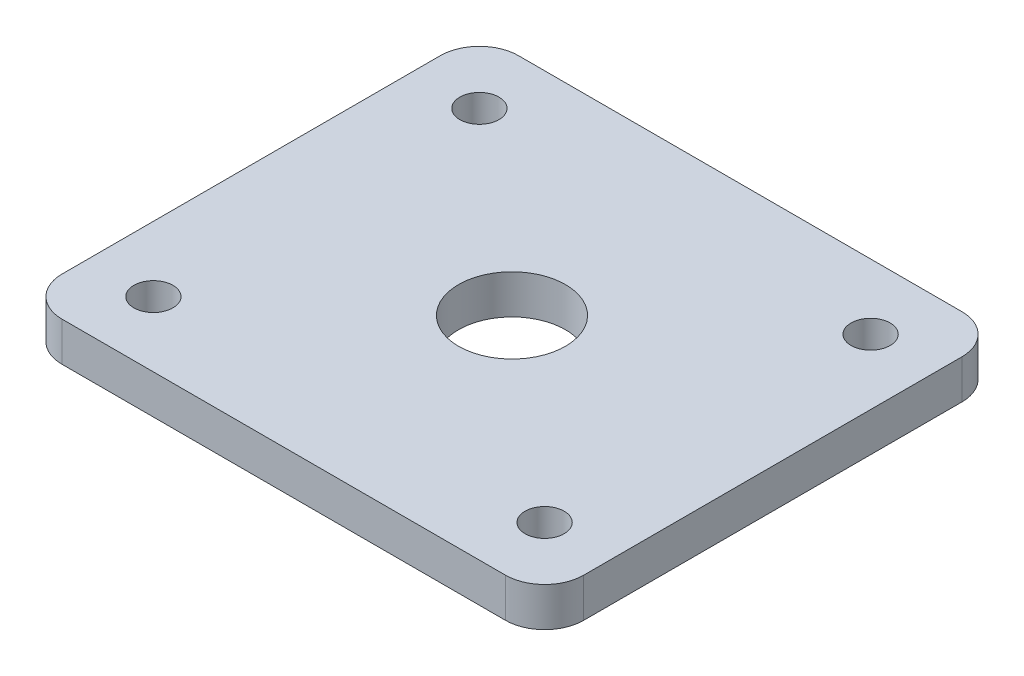
ISO-10303-21;
HEADER;
FILE_DESCRIPTION(('STEP AP214'),'2;1');
FILE_NAME('part.step','',(''),(''),'','','');
FILE_SCHEMA(('AUTOMOTIVE_DESIGN { 1 0 10303 214 1 1 1 1 }'));
ENDSEC;
DATA;
#1=APPLICATION_CONTEXT('core data for automotive mechanical design processes');
#2=APPLICATION_PROTOCOL_DEFINITION('international standard','automotive_design',2000,#1);
#3=PRODUCT_CONTEXT('',#1,'mechanical');
#4=PRODUCT('Part','Part','',(#3));
#5=PRODUCT_RELATED_PRODUCT_CATEGORY('part','',(#4));
#6=PRODUCT_DEFINITION_FORMATION('','',#4);
#7=PRODUCT_DEFINITION_CONTEXT('part definition',#1,'design');
#8=PRODUCT_DEFINITION('design','',#6,#7);
#9=PRODUCT_DEFINITION_SHAPE('','',#8);
#10=(LENGTH_UNIT() NAMED_UNIT(*) SI_UNIT(.MILLI.,.METRE.));
#11=(NAMED_UNIT(*) PLANE_ANGLE_UNIT() SI_UNIT($,.RADIAN.));
#12=(NAMED_UNIT(*) SI_UNIT($,.STERADIAN.) SOLID_ANGLE_UNIT());
#13=UNCERTAINTY_MEASURE_WITH_UNIT(LENGTH_MEASURE(1.E-05),#10,'distance_accuracy_value','');
#14=(GEOMETRIC_REPRESENTATION_CONTEXT(3) GLOBAL_UNCERTAINTY_ASSIGNED_CONTEXT((#13)) GLOBAL_UNIT_ASSIGNED_CONTEXT((#10,
#11,#12)) REPRESENTATION_CONTEXT('',''));
#15=CARTESIAN_POINT('',(0.,0.,0.));
#16=DIRECTION('',(0.,0.,1.));
#17=DIRECTION('',(1.,0.,0.));
#18=AXIS2_PLACEMENT_3D('',#15,#16,#17);
#19=CARTESIAN_POINT('',(0.,3.,-30.));
#20=DIRECTION('',(0.,0.,-1.));
#21=DIRECTION('',(-1.,0.,0.));
#22=AXIS2_PLACEMENT_3D('',#19,#20,#21);
#23=PLANE('',#22);
#24=DIRECTION('',(1.,0.,0.));
#25=VECTOR('',#24,1.);
#26=CARTESIAN_POINT('',(0.,3.,-30.));
#27=LINE('',#26,#25);
#28=CARTESIAN_POINT('',(-2.00000000000009,3.,-30.));
#29=VERTEX_POINT('',#28);
#30=CARTESIAN_POINT('',(31.9999999999999,3.,-30.));
#31=VERTEX_POINT('',#30);
#32=EDGE_CURVE('E157',#29,#31,#27,.T.);
#33=ORIENTED_EDGE('',*,*,#32,.T.);
#34=DIRECTION('',(0.,-1.,0.));
#35=VECTOR('',#34,1.);
#36=CARTESIAN_POINT('',(31.9999999999999,3.,-30.));
#37=LINE('',#36,#35);
#38=CARTESIAN_POINT('',(31.9999999999999,0.,-30.));
#39=VERTEX_POINT('',#38);
#40=EDGE_CURVE('E11',#31,#39,#37,.T.);
#41=ORIENTED_EDGE('',*,*,#40,.T.);
#42=DIRECTION('',(1.,0.,0.));
#43=VECTOR('',#42,1.);
#44=CARTESIAN_POINT('',(0.,0.,-30.));
#45=LINE('',#44,#43);
#46=CARTESIAN_POINT('',(-2.00000000000009,0.,-30.));
#47=VERTEX_POINT('',#46);
#48=EDGE_CURVE('E107',#47,#39,#45,.T.);
#49=ORIENTED_EDGE('',*,*,#48,.F.);
#50=DIRECTION('',(0.,-1.,0.));
#51=VECTOR('',#50,1.);
#52=CARTESIAN_POINT('',(-2.00000000000009,3.,-30.));
#53=LINE('',#52,#51);
#54=EDGE_CURVE('E42',#47,#29,#53,.F.);
#55=ORIENTED_EDGE('',*,*,#54,.T.);
#56=EDGE_LOOP('',(#33,#41,#49,#55));
#57=FACE_BOUND('',#56,.T.);
#58=ADVANCED_FACE('F34',(#57),#23,.T.);
#59=CARTESIAN_POINT('',(-5.00000000000009,3.,0.));
#60=DIRECTION('',(1.,0.,0.));
#61=DIRECTION('',(0.,0.,-1.));
#62=AXIS2_PLACEMENT_3D('',#59,#60,#61);
#63=PLANE('',#62);
#64=DIRECTION('',(0.,0.,1.));
#65=VECTOR('',#64,1.);
#66=CARTESIAN_POINT('',(-5.00000000000009,0.,0.));
#67=LINE('',#66,#65);
#68=CARTESIAN_POINT('',(-5.00000000000009,0.,-27.));
#69=VERTEX_POINT('',#68);
#70=CARTESIAN_POINT('',(-5.00000000000009,0.,2.));
#71=VERTEX_POINT('',#70);
#72=EDGE_CURVE('E168',#69,#71,#67,.T.);
#73=ORIENTED_EDGE('',*,*,#72,.T.);
#74=DIRECTION('',(0.,-1.,0.));
#75=VECTOR('',#74,1.);
#76=CARTESIAN_POINT('',(-5.00000000000009,3.,2.));
#77=LINE('',#76,#75);
#78=CARTESIAN_POINT('',(-5.00000000000009,3.,2.));
#79=VERTEX_POINT('',#78);
#80=EDGE_CURVE('E49',#71,#79,#77,.F.);
#81=ORIENTED_EDGE('',*,*,#80,.T.);
#82=DIRECTION('',(0.,0.,1.));
#83=VECTOR('',#82,1.);
#84=CARTESIAN_POINT('',(-5.00000000000009,3.,0.));
#85=LINE('',#84,#83);
#86=CARTESIAN_POINT('',(-5.00000000000009,3.,-27.));
#87=VERTEX_POINT('',#86);
#88=EDGE_CURVE('E162',#87,#79,#85,.T.);
#89=ORIENTED_EDGE('',*,*,#88,.F.);
#90=DIRECTION('',(0.,-1.,0.));
#91=VECTOR('',#90,1.);
#92=CARTESIAN_POINT('',(-5.00000000000009,0.,-27.));
#93=LINE('',#92,#91);
#94=EDGE_CURVE('E151',#87,#69,#93,.T.);
#95=ORIENTED_EDGE('',*,*,#94,.T.);
#96=EDGE_LOOP('',(#73,#81,#89,#95));
#97=FACE_BOUND('',#96,.T.);
#98=ADVANCED_FACE('F167',(#97),#63,.F.);
#99=CARTESIAN_POINT('',(0.,3.,5.));
#100=DIRECTION('',(0.,0.,-1.));
#101=DIRECTION('',(-1.,0.,0.));
#102=AXIS2_PLACEMENT_3D('',#99,#100,#101);
#103=PLANE('',#102);
#104=DIRECTION('',(1.,0.,0.));
#105=VECTOR('',#104,1.);
#106=CARTESIAN_POINT('',(0.,0.,5.));
#107=LINE('',#106,#105);
#108=CARTESIAN_POINT('',(-2.00000000000009,0.,5.));
#109=VERTEX_POINT('',#108);
#110=CARTESIAN_POINT('',(31.9999999999999,0.,5.));
#111=VERTEX_POINT('',#110);
#112=EDGE_CURVE('E123',#109,#111,#107,.T.);
#113=ORIENTED_EDGE('',*,*,#112,.T.);
#114=DIRECTION('',(0.,-1.,0.));
#115=VECTOR('',#114,1.);
#116=CARTESIAN_POINT('',(31.9999999999999,3.,5.));
#117=LINE('',#116,#115);
#118=CARTESIAN_POINT('',(31.9999999999999,3.,5.));
#119=VERTEX_POINT('',#118);
#120=EDGE_CURVE('E143',#111,#119,#117,.F.);
#121=ORIENTED_EDGE('',*,*,#120,.T.);
#122=DIRECTION('',(1.,0.,0.));
#123=VECTOR('',#122,1.);
#124=CARTESIAN_POINT('',(0.,3.,5.));
#125=LINE('',#124,#123);
#126=CARTESIAN_POINT('',(-2.00000000000009,3.,5.));
#127=VERTEX_POINT('',#126);
#128=EDGE_CURVE('E188',#127,#119,#125,.T.);
#129=ORIENTED_EDGE('',*,*,#128,.F.);
#130=DIRECTION('',(0.,-1.,0.));
#131=VECTOR('',#130,1.);
#132=CARTESIAN_POINT('',(-2.00000000000009,3.,5.));
#133=LINE('',#132,#131);
#134=EDGE_CURVE('E140',#127,#109,#133,.T.);
#135=ORIENTED_EDGE('',*,*,#134,.T.);
#136=EDGE_LOOP('',(#113,#121,#129,#135));
#137=FACE_BOUND('',#136,.T.);
#138=ADVANCED_FACE('F226',(#137),#103,.F.);
#139=CARTESIAN_POINT('',(34.9999999999999,3.,0.));
#140=DIRECTION('',(1.,0.,0.));
#141=DIRECTION('',(0.,0.,-1.));
#142=AXIS2_PLACEMENT_3D('',#139,#140,#141);
#143=PLANE('',#142);
#144=DIRECTION('',(0.,0.,1.));
#145=VECTOR('',#144,1.);
#146=CARTESIAN_POINT('',(34.9999999999999,3.,0.));
#147=LINE('',#146,#145);
#148=CARTESIAN_POINT('',(34.9999999999999,3.,-27.));
#149=VERTEX_POINT('',#148);
#150=CARTESIAN_POINT('',(34.9999999999999,3.,2.));
#151=VERTEX_POINT('',#150);
#152=EDGE_CURVE('E132',#149,#151,#147,.T.);
#153=ORIENTED_EDGE('',*,*,#152,.T.);
#154=DIRECTION('',(0.,-1.,0.));
#155=VECTOR('',#154,1.);
#156=CARTESIAN_POINT('',(34.9999999999999,0.,2.));
#157=LINE('',#156,#155);
#158=CARTESIAN_POINT('',(34.9999999999999,0.,2.));
#159=VERTEX_POINT('',#158);
#160=EDGE_CURVE('E121',#151,#159,#157,.T.);
#161=ORIENTED_EDGE('',*,*,#160,.T.);
#162=DIRECTION('',(0.,0.,1.));
#163=VECTOR('',#162,1.);
#164=CARTESIAN_POINT('',(34.9999999999999,0.,0.));
#165=LINE('',#164,#163);
#166=CARTESIAN_POINT('',(34.9999999999999,0.,-27.));
#167=VERTEX_POINT('',#166);
#168=EDGE_CURVE('E105',#167,#159,#165,.T.);
#169=ORIENTED_EDGE('',*,*,#168,.F.);
#170=DIRECTION('',(0.,-1.,0.));
#171=VECTOR('',#170,1.);
#172=CARTESIAN_POINT('',(34.9999999999999,3.,-27.));
#173=LINE('',#172,#171);
#174=EDGE_CURVE('E118',#167,#149,#173,.F.);
#175=ORIENTED_EDGE('',*,*,#174,.T.);
#176=EDGE_LOOP('',(#153,#161,#169,#175));
#177=FACE_BOUND('',#176,.T.);
#178=ADVANCED_FACE('F117',(#177),#143,.T.);
#179=CARTESIAN_POINT('',(0.,3.,0.));
#180=DIRECTION('',(0.,-1.,0.));
#181=DIRECTION('',(0.,0.,-1.));
#182=AXIS2_PLACEMENT_3D('',#179,#180,#181);
#183=CYLINDRICAL_SURFACE('',#182,1.5);
#184=CARTESIAN_POINT('',(0.,3.,0.));
#185=DIRECTION('',(0.,1.,0.));
#186=DIRECTION('',(0.,0.,1.));
#187=AXIS2_PLACEMENT_3D('',#184,#185,#186);
#188=CIRCLE('',#187,1.5);
#189=CARTESIAN_POINT('',(0.,3.,1.5));
#190=VERTEX_POINT('',#189);
#191=EDGE_CURVE('E163',#190,#190,#188,.T.);
#192=ORIENTED_EDGE('',*,*,#191,.T.);
#193=EDGE_LOOP('',(#192));
#194=FACE_BOUND('',#193,.T.);
#195=CARTESIAN_POINT('',(0.,0.,0.));
#196=DIRECTION('',(0.,1.,0.));
#197=DIRECTION('',(0.,0.,1.));
#198=AXIS2_PLACEMENT_3D('',#195,#196,#197);
#199=CIRCLE('',#198,1.5);
#200=CARTESIAN_POINT('',(0.,0.,1.5));
#201=VERTEX_POINT('',#200);
#202=EDGE_CURVE('E173',#201,#201,#199,.T.);
#203=ORIENTED_EDGE('',*,*,#202,.F.);
#204=EDGE_LOOP('',(#203));
#205=FACE_BOUND('',#204,.T.);
#206=ADVANCED_FACE('F230',(#194,#205),#183,.F.);
#207=CARTESIAN_POINT('',(30.,3.,0.));
#208=DIRECTION('',(0.,-1.,0.));
#209=DIRECTION('',(0.,0.,-1.));
#210=AXIS2_PLACEMENT_3D('',#207,#208,#209);
#211=CYLINDRICAL_SURFACE('',#210,1.5);
#212=CARTESIAN_POINT('',(30.,3.,0.));
#213=DIRECTION('',(0.,1.,0.));
#214=DIRECTION('',(0.,0.,1.));
#215=AXIS2_PLACEMENT_3D('',#212,#213,#214);
#216=CIRCLE('',#215,1.5);
#217=CARTESIAN_POINT('',(30.,3.,1.5));
#218=VERTEX_POINT('',#217);
#219=EDGE_CURVE('E193',#218,#218,#216,.T.);
#220=ORIENTED_EDGE('',*,*,#219,.T.);
#221=EDGE_LOOP('',(#220));
#222=FACE_BOUND('',#221,.T.);
#223=CARTESIAN_POINT('',(30.,0.,0.));
#224=DIRECTION('',(0.,1.,0.));
#225=DIRECTION('',(0.,0.,1.));
#226=AXIS2_PLACEMENT_3D('',#223,#224,#225);
#227=CIRCLE('',#226,1.5);
#228=CARTESIAN_POINT('',(30.,0.,1.5));
#229=VERTEX_POINT('',#228);
#230=EDGE_CURVE('E178',#229,#229,#227,.T.);
#231=ORIENTED_EDGE('',*,*,#230,.F.);
#232=EDGE_LOOP('',(#231));
#233=FACE_BOUND('',#232,.T.);
#234=ADVANCED_FACE('F233',(#222,#233),#211,.F.);
#235=CARTESIAN_POINT('',(29.9999999999999,3.,-25.));
#236=DIRECTION('',(0.,-1.,0.));
#237=DIRECTION('',(0.,0.,-1.));
#238=AXIS2_PLACEMENT_3D('',#235,#236,#237);
#239=CYLINDRICAL_SURFACE('',#238,1.5);
#240=CARTESIAN_POINT('',(29.9999999999999,3.,-25.));
#241=DIRECTION('',(0.,1.,0.));
#242=DIRECTION('',(0.,0.,1.));
#243=AXIS2_PLACEMENT_3D('',#240,#241,#242);
#244=CIRCLE('',#243,1.5);
#245=CARTESIAN_POINT('',(29.9999999999999,3.,-23.5));
#246=VERTEX_POINT('',#245);
#247=EDGE_CURVE('E196',#246,#246,#244,.T.);
#248=ORIENTED_EDGE('',*,*,#247,.T.);
#249=EDGE_LOOP('',(#248));
#250=FACE_BOUND('',#249,.T.);
#251=CARTESIAN_POINT('',(29.9999999999999,0.,-25.));
#252=DIRECTION('',(0.,1.,0.));
#253=DIRECTION('',(0.,0.,1.));
#254=AXIS2_PLACEMENT_3D('',#251,#252,#253);
#255=CIRCLE('',#254,1.5);
#256=CARTESIAN_POINT('',(29.9999999999999,0.,-23.5));
#257=VERTEX_POINT('',#256);
#258=EDGE_CURVE('E181',#257,#257,#255,.T.);
#259=ORIENTED_EDGE('',*,*,#258,.F.);
#260=EDGE_LOOP('',(#259));
#261=FACE_BOUND('',#260,.T.);
#262=ADVANCED_FACE('F217',(#250,#261),#239,.F.);
#263=CARTESIAN_POINT('',(0.,3.,-25.));
#264=DIRECTION('',(0.,-1.,0.));
#265=DIRECTION('',(0.,0.,-1.));
#266=AXIS2_PLACEMENT_3D('',#263,#264,#265);
#267=CYLINDRICAL_SURFACE('',#266,1.5);
#268=CARTESIAN_POINT('',(0.,3.,-25.));
#269=DIRECTION('',(0.,1.,0.));
#270=DIRECTION('',(0.,0.,1.));
#271=AXIS2_PLACEMENT_3D('',#268,#269,#270);
#272=CIRCLE('',#271,1.5);
#273=CARTESIAN_POINT('',(0.,3.,-23.5));
#274=VERTEX_POINT('',#273);
#275=EDGE_CURVE('E199',#274,#274,#272,.T.);
#276=ORIENTED_EDGE('',*,*,#275,.T.);
#277=EDGE_LOOP('',(#276));
#278=FACE_BOUND('',#277,.T.);
#279=CARTESIAN_POINT('',(0.,0.,-25.));
#280=DIRECTION('',(0.,1.,0.));
#281=DIRECTION('',(0.,0.,1.));
#282=AXIS2_PLACEMENT_3D('',#279,#280,#281);
#283=CIRCLE('',#282,1.5);
#284=CARTESIAN_POINT('',(0.,0.,-23.5));
#285=VERTEX_POINT('',#284);
#286=EDGE_CURVE('E184',#285,#285,#283,.T.);
#287=ORIENTED_EDGE('',*,*,#286,.F.);
#288=EDGE_LOOP('',(#287));
#289=FACE_BOUND('',#288,.T.);
#290=ADVANCED_FACE('F208',(#278,#289),#267,.F.);
#291=CARTESIAN_POINT('',(14.9999999999999,3.,-12.5));
#292=DIRECTION('',(0.,-1.,0.));
#293=DIRECTION('',(0.,0.,-1.));
#294=AXIS2_PLACEMENT_3D('',#291,#292,#293);
#295=CYLINDRICAL_SURFACE('',#294,4.1);
#296=CARTESIAN_POINT('',(14.9999999999999,3.,-12.5));
#297=DIRECTION('',(0.,1.,0.));
#298=DIRECTION('',(0.,0.,1.));
#299=AXIS2_PLACEMENT_3D('',#296,#297,#298);
#300=CIRCLE('',#299,4.1);
#301=CARTESIAN_POINT('',(14.9999999999999,3.,-8.4));
#302=VERTEX_POINT('',#301);
#303=EDGE_CURVE('E128',#302,#302,#300,.T.);
#304=ORIENTED_EDGE('',*,*,#303,.T.);
#305=EDGE_LOOP('',(#304));
#306=FACE_BOUND('',#305,.T.);
#307=CARTESIAN_POINT('',(14.9999999999999,0.,-12.5));
#308=DIRECTION('',(0.,1.,0.));
#309=DIRECTION('',(0.,0.,1.));
#310=AXIS2_PLACEMENT_3D('',#307,#308,#309);
#311=CIRCLE('',#310,4.1);
#312=CARTESIAN_POINT('',(14.9999999999999,0.,-8.4));
#313=VERTEX_POINT('',#312);
#314=EDGE_CURVE('E122',#313,#313,#311,.T.);
#315=ORIENTED_EDGE('',*,*,#314,.F.);
#316=EDGE_LOOP('',(#315));
#317=FACE_BOUND('',#316,.T.);
#318=ADVANCED_FACE('F206',(#306,#317),#295,.F.);
#319=CARTESIAN_POINT('',(0.,3.,0.));
#320=DIRECTION('',(0.,1.,0.));
#321=DIRECTION('',(0.,0.,1.));
#322=AXIS2_PLACEMENT_3D('',#319,#320,#321);
#323=PLANE('',#322);
#324=ORIENTED_EDGE('',*,*,#275,.F.);
#325=EDGE_LOOP('',(#324));
#326=FACE_BOUND('',#325,.T.);
#327=ORIENTED_EDGE('',*,*,#247,.F.);
#328=EDGE_LOOP('',(#327));
#329=FACE_BOUND('',#328,.T.);
#330=ORIENTED_EDGE('',*,*,#219,.F.);
#331=EDGE_LOOP('',(#330));
#332=FACE_BOUND('',#331,.T.);
#333=ORIENTED_EDGE('',*,*,#191,.F.);
#334=EDGE_LOOP('',(#333));
#335=FACE_BOUND('',#334,.T.);
#336=ORIENTED_EDGE('',*,*,#128,.T.);
#337=CARTESIAN_POINT('',(31.9999999999999,3.,2.));
#338=DIRECTION('',(0.,1.,0.));
#339=DIRECTION('',(0.,0.,1.));
#340=AXIS2_PLACEMENT_3D('',#337,#338,#339);
#341=CIRCLE('',#340,3.);
#342=EDGE_CURVE('E149',#119,#151,#341,.T.);
#343=ORIENTED_EDGE('',*,*,#342,.T.);
#344=ORIENTED_EDGE('',*,*,#152,.F.);
#345=CARTESIAN_POINT('',(31.9999999999999,3.,-27.));
#346=DIRECTION('',(0.,1.,0.));
#347=DIRECTION('',(0.,0.,1.));
#348=AXIS2_PLACEMENT_3D('',#345,#346,#347);
#349=CIRCLE('',#348,3.);
#350=EDGE_CURVE('E127',#149,#31,#349,.T.);
#351=ORIENTED_EDGE('',*,*,#350,.T.);
#352=ORIENTED_EDGE('',*,*,#32,.F.);
#353=CARTESIAN_POINT('',(-2.00000000000009,3.,-27.));
#354=DIRECTION('',(0.,1.,0.));
#355=DIRECTION('',(0.,0.,1.));
#356=AXIS2_PLACEMENT_3D('',#353,#354,#355);
#357=CIRCLE('',#356,3.);
#358=EDGE_CURVE('E56',#29,#87,#357,.T.);
#359=ORIENTED_EDGE('',*,*,#358,.T.);
#360=ORIENTED_EDGE('',*,*,#88,.T.);
#361=CARTESIAN_POINT('',(-2.00000000000009,3.,2.));
#362=DIRECTION('',(0.,1.,0.));
#363=DIRECTION('',(0.,0.,1.));
#364=AXIS2_PLACEMENT_3D('',#361,#362,#363);
#365=CIRCLE('',#364,3.);
#366=EDGE_CURVE('E147',#79,#127,#365,.T.);
#367=ORIENTED_EDGE('',*,*,#366,.T.);
#368=EDGE_LOOP('',(#336,#343,#344,#351,#352,#359,#360,#367));
#369=FACE_BOUND('',#368,.T.);
#370=ORIENTED_EDGE('',*,*,#303,.F.);
#371=EDGE_LOOP('',(#370));
#372=FACE_BOUND('',#371,.T.);
#373=ADVANCED_FACE('F160',(#326,#329,#332,#335,#369,#372),#323,.T.);
#374=CARTESIAN_POINT('',(0.,0.,0.));
#375=DIRECTION('',(0.,1.,0.));
#376=DIRECTION('',(0.,0.,1.));
#377=AXIS2_PLACEMENT_3D('',#374,#375,#376);
#378=PLANE('',#377);
#379=ORIENTED_EDGE('',*,*,#286,.T.);
#380=EDGE_LOOP('',(#379));
#381=FACE_BOUND('',#380,.T.);
#382=ORIENTED_EDGE('',*,*,#258,.T.);
#383=EDGE_LOOP('',(#382));
#384=FACE_BOUND('',#383,.T.);
#385=ORIENTED_EDGE('',*,*,#230,.T.);
#386=EDGE_LOOP('',(#385));
#387=FACE_BOUND('',#386,.T.);
#388=ORIENTED_EDGE('',*,*,#202,.T.);
#389=EDGE_LOOP('',(#388));
#390=FACE_BOUND('',#389,.T.);
#391=ORIENTED_EDGE('',*,*,#168,.T.);
#392=CARTESIAN_POINT('',(31.9999999999999,0.,2.));
#393=DIRECTION('',(0.,1.,0.));
#394=DIRECTION('',(0.,0.,1.));
#395=AXIS2_PLACEMENT_3D('',#392,#393,#394);
#396=CIRCLE('',#395,3.);
#397=EDGE_CURVE('E138',#159,#111,#396,.F.);
#398=ORIENTED_EDGE('',*,*,#397,.T.);
#399=ORIENTED_EDGE('',*,*,#112,.F.);
#400=CARTESIAN_POINT('',(-2.00000000000009,0.,2.));
#401=DIRECTION('',(0.,1.,0.));
#402=DIRECTION('',(0.,0.,1.));
#403=AXIS2_PLACEMENT_3D('',#400,#401,#402);
#404=CIRCLE('',#403,3.);
#405=EDGE_CURVE('E111',#109,#71,#404,.F.);
#406=ORIENTED_EDGE('',*,*,#405,.T.);
#407=ORIENTED_EDGE('',*,*,#72,.F.);
#408=CARTESIAN_POINT('',(-2.00000000000009,0.,-27.));
#409=DIRECTION('',(0.,1.,0.));
#410=DIRECTION('',(0.,0.,1.));
#411=AXIS2_PLACEMENT_3D('',#408,#409,#410);
#412=CIRCLE('',#411,3.);
#413=EDGE_CURVE('E112',#69,#47,#412,.F.);
#414=ORIENTED_EDGE('',*,*,#413,.T.);
#415=ORIENTED_EDGE('',*,*,#48,.T.);
#416=CARTESIAN_POINT('',(31.9999999999999,0.,-27.));
#417=DIRECTION('',(0.,1.,0.));
#418=DIRECTION('',(0.,0.,1.));
#419=AXIS2_PLACEMENT_3D('',#416,#417,#418);
#420=CIRCLE('',#419,3.);
#421=EDGE_CURVE('E101',#39,#167,#420,.F.);
#422=ORIENTED_EDGE('',*,*,#421,.T.);
#423=EDGE_LOOP('',(#391,#398,#399,#406,#407,#414,#415,#422));
#424=FACE_BOUND('',#423,.T.);
#425=ORIENTED_EDGE('',*,*,#314,.T.);
#426=EDGE_LOOP('',(#425));
#427=FACE_BOUND('',#426,.T.);
#428=ADVANCED_FACE('F103',(#381,#384,#387,#390,#424,#427),#378,.F.);
#429=CARTESIAN_POINT('',(31.9999999999999,3.,2.));
#430=DIRECTION('',(0.,1.,0.));
#431=DIRECTION('',(0.,0.,1.));
#432=AXIS2_PLACEMENT_3D('',#429,#430,#431);
#433=CYLINDRICAL_SURFACE('',#432,3.);
#434=ORIENTED_EDGE('',*,*,#342,.F.);
#435=ORIENTED_EDGE('',*,*,#120,.F.);
#436=ORIENTED_EDGE('',*,*,#397,.F.);
#437=ORIENTED_EDGE('',*,*,#160,.F.);
#438=EDGE_LOOP('',(#434,#435,#436,#437));
#439=FACE_BOUND('',#438,.T.);
#440=ADVANCED_FACE('F241',(#439),#433,.T.);
#441=CARTESIAN_POINT('',(-2.00000000000009,3.,2.));
#442=DIRECTION('',(0.,-1.,0.));
#443=DIRECTION('',(0.,0.,-1.));
#444=AXIS2_PLACEMENT_3D('',#441,#442,#443);
#445=CYLINDRICAL_SURFACE('',#444,3.);
#446=ORIENTED_EDGE('',*,*,#366,.F.);
#447=ORIENTED_EDGE('',*,*,#80,.F.);
#448=ORIENTED_EDGE('',*,*,#405,.F.);
#449=ORIENTED_EDGE('',*,*,#134,.F.);
#450=EDGE_LOOP('',(#446,#447,#448,#449));
#451=FACE_BOUND('',#450,.T.);
#452=ADVANCED_FACE('F244',(#451),#445,.T.);
#453=CARTESIAN_POINT('',(31.9999999999999,3.,-27.));
#454=DIRECTION('',(0.,-1.,0.));
#455=DIRECTION('',(0.,0.,-1.));
#456=AXIS2_PLACEMENT_3D('',#453,#454,#455);
#457=CYLINDRICAL_SURFACE('',#456,3.);
#458=ORIENTED_EDGE('',*,*,#350,.F.);
#459=ORIENTED_EDGE('',*,*,#174,.F.);
#460=ORIENTED_EDGE('',*,*,#421,.F.);
#461=ORIENTED_EDGE('',*,*,#40,.F.);
#462=EDGE_LOOP('',(#458,#459,#460,#461));
#463=FACE_BOUND('',#462,.T.);
#464=ADVANCED_FACE('F126',(#463),#457,.T.);
#465=CARTESIAN_POINT('',(-2.00000000000009,3.,-27.));
#466=DIRECTION('',(0.,1.,0.));
#467=DIRECTION('',(0.,0.,1.));
#468=AXIS2_PLACEMENT_3D('',#465,#466,#467);
#469=CYLINDRICAL_SURFACE('',#468,3.);
#470=ORIENTED_EDGE('',*,*,#358,.F.);
#471=ORIENTED_EDGE('',*,*,#54,.F.);
#472=ORIENTED_EDGE('',*,*,#413,.F.);
#473=ORIENTED_EDGE('',*,*,#94,.F.);
#474=EDGE_LOOP('',(#470,#471,#472,#473));
#475=FACE_BOUND('',#474,.T.);
#476=ADVANCED_FACE('F36',(#475),#469,.T.);
#477=CLOSED_SHELL('',(#58,#98,#138,#178,#206,#234,#262,#290,#318,#373,#428,#440,#452,#464,#476));
#478=MANIFOLD_SOLID_BREP('B2',#477);
#479=ADVANCED_BREP_SHAPE_REPRESENTATION('',(#18,#478),#14);
#480=SHAPE_DEFINITION_REPRESENTATION(#9,#479);
ENDSEC;
END-ISO-10303-21;
